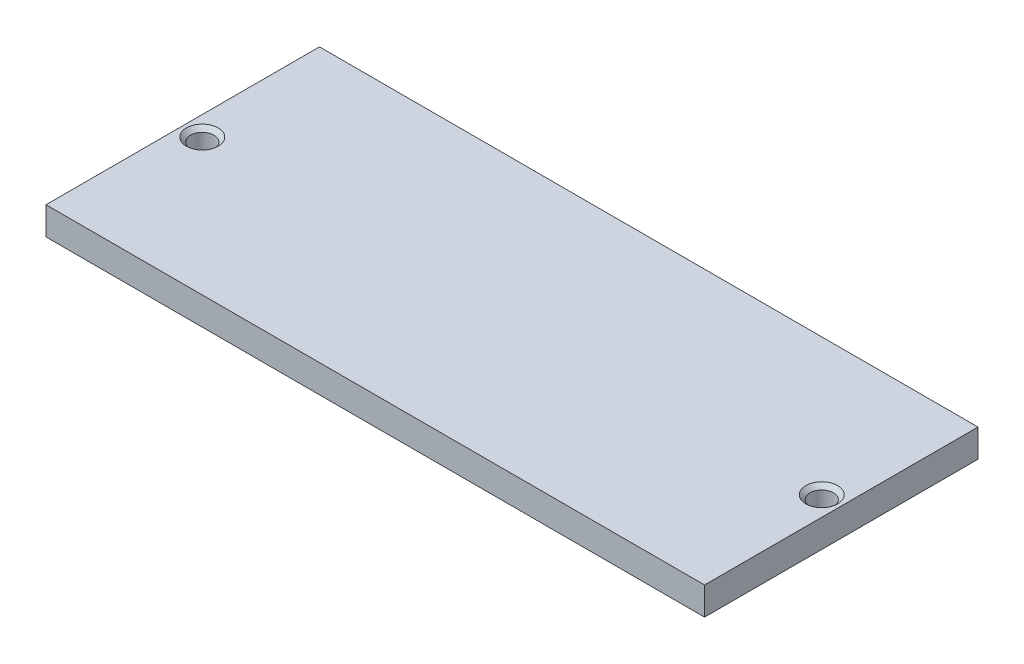
ISO-10303-21;
HEADER;
FILE_DESCRIPTION(('STEP AP214'),'2;1');
FILE_NAME('part.step','',(''),(''),'','','');
FILE_SCHEMA(('AUTOMOTIVE_DESIGN { 1 0 10303 214 1 1 1 1 }'));
ENDSEC;
DATA;
#1=APPLICATION_CONTEXT('core data for automotive mechanical design processes');
#2=APPLICATION_PROTOCOL_DEFINITION('international standard','automotive_design',2000,#1);
#3=PRODUCT_CONTEXT('',#1,'mechanical');
#4=PRODUCT('Part','Part','',(#3));
#5=PRODUCT_RELATED_PRODUCT_CATEGORY('part','',(#4));
#6=PRODUCT_DEFINITION_FORMATION('','',#4);
#7=PRODUCT_DEFINITION_CONTEXT('part definition',#1,'design');
#8=PRODUCT_DEFINITION('design','',#6,#7);
#9=PRODUCT_DEFINITION_SHAPE('','',#8);
#10=(LENGTH_UNIT() NAMED_UNIT(*) SI_UNIT(.MILLI.,.METRE.));
#11=(NAMED_UNIT(*) PLANE_ANGLE_UNIT() SI_UNIT($,.RADIAN.));
#12=(NAMED_UNIT(*) SI_UNIT($,.STERADIAN.) SOLID_ANGLE_UNIT());
#13=UNCERTAINTY_MEASURE_WITH_UNIT(LENGTH_MEASURE(1.E-05),#10,'distance_accuracy_value','');
#14=(GEOMETRIC_REPRESENTATION_CONTEXT(3) GLOBAL_UNCERTAINTY_ASSIGNED_CONTEXT((#13)) GLOBAL_UNIT_ASSIGNED_CONTEXT((#10,
#11,#12)) REPRESENTATION_CONTEXT('',''));
#15=CARTESIAN_POINT('',(0.,0.,0.));
#16=DIRECTION('',(0.,0.,1.));
#17=DIRECTION('',(1.,0.,0.));
#18=AXIS2_PLACEMENT_3D('',#15,#16,#17);
#19=CARTESIAN_POINT('',(59.,31.6666666666667,-29.));
#20=DIRECTION('',(-1.,0.,0.));
#21=DIRECTION('',(0.,0.,1.));
#22=AXIS2_PLACEMENT_3D('',#19,#20,#21);
#23=PLANE('',#22);
#24=DIRECTION('',(0.,0.,-1.));
#25=VECTOR('',#24,1.);
#26=CARTESIAN_POINT('',(59.,26.6666666666667,-29.));
#27=LINE('',#26,#25);
#28=CARTESIAN_POINT('',(59.,26.6666666666667,20.));
#29=VERTEX_POINT('',#28);
#30=CARTESIAN_POINT('',(59.,26.6666666666667,-29.));
#31=VERTEX_POINT('',#30);
#32=EDGE_CURVE('E108',#29,#31,#27,.T.);
#33=ORIENTED_EDGE('',*,*,#32,.T.);
#34=DIRECTION('',(0.,-1.,0.));
#35=VECTOR('',#34,1.);
#36=CARTESIAN_POINT('',(59.,31.6666666666667,-29.));
#37=LINE('',#36,#35);
#38=CARTESIAN_POINT('',(59.,31.6666666666667,-29.));
#39=VERTEX_POINT('',#38);
#40=EDGE_CURVE('E99',#39,#31,#37,.T.);
#41=ORIENTED_EDGE('',*,*,#40,.F.);
#42=DIRECTION('',(0.,0.,-1.));
#43=VECTOR('',#42,1.);
#44=CARTESIAN_POINT('',(59.,31.6666666666667,-29.));
#45=LINE('',#44,#43);
#46=CARTESIAN_POINT('',(59.,31.6666666666667,20.));
#47=VERTEX_POINT('',#46);
#48=EDGE_CURVE('E93',#47,#39,#45,.T.);
#49=ORIENTED_EDGE('',*,*,#48,.F.);
#50=DIRECTION('',(0.,-1.,0.));
#51=VECTOR('',#50,1.);
#52=CARTESIAN_POINT('',(59.,31.6666666666667,20.));
#53=LINE('',#52,#51);
#54=EDGE_CURVE('E104',#47,#29,#53,.T.);
#55=ORIENTED_EDGE('',*,*,#54,.T.);
#56=EDGE_LOOP('',(#33,#41,#49,#55));
#57=FACE_BOUND('',#56,.T.);
#58=ADVANCED_FACE('F39',(#57),#23,.F.);
#59=CARTESIAN_POINT('',(59.,31.6666666666667,-29.));
#60=DIRECTION('',(0.,0.,1.));
#61=DIRECTION('',(0.,-1.,0.));
#62=AXIS2_PLACEMENT_3D('',#59,#60,#61);
#63=PLANE('',#62);
#64=DIRECTION('',(-1.,0.,0.));
#65=VECTOR('',#64,1.);
#66=CARTESIAN_POINT('',(59.,26.6666666666667,-29.));
#67=LINE('',#66,#65);
#68=CARTESIAN_POINT('',(-59.,26.6666666666667,-29.));
#69=VERTEX_POINT('',#68);
#70=EDGE_CURVE('E98',#31,#69,#67,.T.);
#71=ORIENTED_EDGE('',*,*,#70,.T.);
#72=DIRECTION('',(0.,-1.,0.));
#73=VECTOR('',#72,1.);
#74=CARTESIAN_POINT('',(-59.,31.6666666666667,-29.));
#75=LINE('',#74,#73);
#76=CARTESIAN_POINT('',(-59.,31.6666666666667,-29.));
#77=VERTEX_POINT('',#76);
#78=EDGE_CURVE('E96',#77,#69,#75,.T.);
#79=ORIENTED_EDGE('',*,*,#78,.F.);
#80=DIRECTION('',(-1.,0.,0.));
#81=VECTOR('',#80,1.);
#82=CARTESIAN_POINT('',(59.,31.6666666666667,-29.));
#83=LINE('',#82,#81);
#84=EDGE_CURVE('E88',#39,#77,#83,.T.);
#85=ORIENTED_EDGE('',*,*,#84,.F.);
#86=ORIENTED_EDGE('',*,*,#40,.T.);
#87=EDGE_LOOP('',(#71,#79,#85,#86));
#88=FACE_BOUND('',#87,.T.);
#89=ADVANCED_FACE('F97',(#88),#63,.F.);
#90=CARTESIAN_POINT('',(-59.,31.6666666666667,-29.));
#91=DIRECTION('',(1.,0.,0.));
#92=DIRECTION('',(0.,0.,-1.));
#93=AXIS2_PLACEMENT_3D('',#90,#91,#92);
#94=PLANE('',#93);
#95=DIRECTION('',(0.,0.,1.));
#96=VECTOR('',#95,1.);
#97=CARTESIAN_POINT('',(-59.,26.6666666666667,-29.));
#98=LINE('',#97,#96);
#99=CARTESIAN_POINT('',(-59.,26.6666666666667,20.));
#100=VERTEX_POINT('',#99);
#101=EDGE_CURVE('E74',#69,#100,#98,.T.);
#102=ORIENTED_EDGE('',*,*,#101,.T.);
#103=DIRECTION('',(0.,-1.,0.));
#104=VECTOR('',#103,1.);
#105=CARTESIAN_POINT('',(-59.,31.6666666666667,20.));
#106=LINE('',#105,#104);
#107=CARTESIAN_POINT('',(-59.,31.6666666666667,20.));
#108=VERTEX_POINT('',#107);
#109=EDGE_CURVE('E100',#108,#100,#106,.T.);
#110=ORIENTED_EDGE('',*,*,#109,.F.);
#111=DIRECTION('',(0.,0.,1.));
#112=VECTOR('',#111,1.);
#113=CARTESIAN_POINT('',(-59.,31.6666666666667,-29.));
#114=LINE('',#113,#112);
#115=EDGE_CURVE('E91',#77,#108,#114,.T.);
#116=ORIENTED_EDGE('',*,*,#115,.F.);
#117=ORIENTED_EDGE('',*,*,#78,.T.);
#118=EDGE_LOOP('',(#102,#110,#116,#117));
#119=FACE_BOUND('',#118,.T.);
#120=ADVANCED_FACE('F102',(#119),#94,.F.);
#121=CARTESIAN_POINT('',(59.,31.6666666666667,20.));
#122=DIRECTION('',(0.,0.,-1.));
#123=DIRECTION('',(0.,1.,0.));
#124=AXIS2_PLACEMENT_3D('',#121,#122,#123);
#125=PLANE('',#124);
#126=DIRECTION('',(1.,0.,0.));
#127=VECTOR('',#126,1.);
#128=CARTESIAN_POINT('',(59.,26.6666666666667,20.));
#129=LINE('',#128,#127);
#130=EDGE_CURVE('E80',#100,#29,#129,.T.);
#131=ORIENTED_EDGE('',*,*,#130,.T.);
#132=ORIENTED_EDGE('',*,*,#54,.F.);
#133=DIRECTION('',(1.,0.,0.));
#134=VECTOR('',#133,1.);
#135=CARTESIAN_POINT('',(59.,31.6666666666667,20.));
#136=LINE('',#135,#134);
#137=EDGE_CURVE('E57',#108,#47,#136,.T.);
#138=ORIENTED_EDGE('',*,*,#137,.F.);
#139=ORIENTED_EDGE('',*,*,#109,.T.);
#140=EDGE_LOOP('',(#131,#132,#138,#139));
#141=FACE_BOUND('',#140,.T.);
#142=ADVANCED_FACE('F148',(#141),#125,.F.);
#143=CARTESIAN_POINT('',(0.,31.6666666666667,0.));
#144=DIRECTION('',(0.,-1.,0.));
#145=DIRECTION('',(0.,0.,-1.));
#146=AXIS2_PLACEMENT_3D('',#143,#144,#145);
#147=PLANE('',#146);
#148=CARTESIAN_POINT('',(55.5,31.6666666666667,-4.49999999999999));
#149=DIRECTION('',(0.,1.,0.));
#150=DIRECTION('',(0.,0.,-1.));
#151=AXIS2_PLACEMENT_3D('',#148,#149,#150);
#152=CIRCLE('',#151,2.85000000000001);
#153=CARTESIAN_POINT('',(55.5,31.6666666666667,-7.34999999999999));
#154=VERTEX_POINT('',#153);
#155=EDGE_CURVE('E164',#154,#154,#152,.T.);
#156=ORIENTED_EDGE('',*,*,#155,.F.);
#157=EDGE_LOOP('',(#156));
#158=FACE_BOUND('',#157,.T.);
#159=CARTESIAN_POINT('',(-55.5,31.6666666666667,-4.49999999999999));
#160=DIRECTION('',(0.,-1.,0.));
#161=DIRECTION('',(0.,0.,-1.));
#162=AXIS2_PLACEMENT_3D('',#159,#160,#161);
#163=CIRCLE('',#162,2.85000000000001);
#164=CARTESIAN_POINT('',(-55.5,31.6666666666667,-7.34999999999999));
#165=VERTEX_POINT('',#164);
#166=EDGE_CURVE('E11',#165,#165,#163,.T.);
#167=ORIENTED_EDGE('',*,*,#166,.T.);
#168=EDGE_LOOP('',(#167));
#169=FACE_BOUND('',#168,.T.);
#170=ORIENTED_EDGE('',*,*,#48,.T.);
#171=ORIENTED_EDGE('',*,*,#84,.T.);
#172=ORIENTED_EDGE('',*,*,#115,.T.);
#173=ORIENTED_EDGE('',*,*,#137,.T.);
#174=EDGE_LOOP('',(#170,#171,#172,#173));
#175=FACE_BOUND('',#174,.T.);
#176=ADVANCED_FACE('F89',(#158,#169,#175),#147,.F.);
#177=CARTESIAN_POINT('',(0.,26.6666666666667,0.));
#178=DIRECTION('',(0.,-1.,0.));
#179=DIRECTION('',(0.,0.,-1.));
#180=AXIS2_PLACEMENT_3D('',#177,#178,#179);
#181=PLANE('',#180);
#182=CARTESIAN_POINT('',(55.5,26.6666666666667,-4.49999999999999));
#183=DIRECTION('',(0.,1.,0.));
#184=DIRECTION('',(0.,0.,-1.));
#185=AXIS2_PLACEMENT_3D('',#182,#183,#184);
#186=CIRCLE('',#185,2.1);
#187=CARTESIAN_POINT('',(55.5,26.6666666666667,-6.59999999999998));
#188=VERTEX_POINT('',#187);
#189=EDGE_CURVE('E167',#188,#188,#186,.T.);
#190=ORIENTED_EDGE('',*,*,#189,.T.);
#191=EDGE_LOOP('',(#190));
#192=FACE_BOUND('',#191,.T.);
#193=CARTESIAN_POINT('',(-55.5,26.6666666666667,-4.49999999999999));
#194=DIRECTION('',(0.,-1.,0.));
#195=DIRECTION('',(0.,0.,-1.));
#196=AXIS2_PLACEMENT_3D('',#193,#194,#195);
#197=CIRCLE('',#196,2.1);
#198=CARTESIAN_POINT('',(-55.5,26.6666666666667,-6.59999999999998));
#199=VERTEX_POINT('',#198);
#200=EDGE_CURVE('E111',#199,#199,#197,.T.);
#201=ORIENTED_EDGE('',*,*,#200,.F.);
#202=EDGE_LOOP('',(#201));
#203=FACE_BOUND('',#202,.T.);
#204=ORIENTED_EDGE('',*,*,#32,.F.);
#205=ORIENTED_EDGE('',*,*,#130,.F.);
#206=ORIENTED_EDGE('',*,*,#101,.F.);
#207=ORIENTED_EDGE('',*,*,#70,.F.);
#208=EDGE_LOOP('',(#204,#205,#206,#207));
#209=FACE_BOUND('',#208,.T.);
#210=ADVANCED_FACE('F136',(#192,#203,#209),#181,.T.);
#211=CARTESIAN_POINT('',(-55.5,10.9968181856832,-4.49999999999999));
#212=DIRECTION('',(0.,1.,0.));
#213=DIRECTION('',(0.,0.,1.));
#214=AXIS2_PLACEMENT_3D('',#211,#212,#213);
#215=CYLINDRICAL_SURFACE('',#214,2.1);
#216=CARTESIAN_POINT('',(-55.5,30.9166666666667,-4.49999999999999));
#217=DIRECTION('',(0.,-1.,0.));
#218=DIRECTION('',(0.,0.,-1.));
#219=AXIS2_PLACEMENT_3D('',#216,#217,#218);
#220=CIRCLE('',#219,2.1);
#221=CARTESIAN_POINT('',(-55.5,30.9166666666667,-6.59999999999998));
#222=VERTEX_POINT('',#221);
#223=EDGE_CURVE('E49',#222,#222,#220,.F.);
#224=ORIENTED_EDGE('',*,*,#223,.T.);
#225=EDGE_LOOP('',(#224));
#226=FACE_BOUND('',#225,.T.);
#227=ORIENTED_EDGE('',*,*,#200,.T.);
#228=EDGE_LOOP('',(#227));
#229=FACE_BOUND('',#228,.T.);
#230=ADVANCED_FACE('F123',(#226,#229),#215,.F.);
#231=CARTESIAN_POINT('',(-55.5,30.9166666666667,-4.49999999999999));
#232=DIRECTION('',(0.,1.,0.));
#233=DIRECTION('',(0.,0.,1.));
#234=AXIS2_PLACEMENT_3D('',#231,#232,#233);
#235=CONICAL_SURFACE('',#234,2.1,0.785398163397444);
#236=ORIENTED_EDGE('',*,*,#166,.F.);
#237=EDGE_LOOP('',(#236));
#238=FACE_BOUND('',#237,.T.);
#239=ORIENTED_EDGE('',*,*,#223,.F.);
#240=EDGE_LOOP('',(#239));
#241=FACE_BOUND('',#240,.T.);
#242=ADVANCED_FACE('F42',(#238,#241),#235,.F.);
#243=CARTESIAN_POINT('',(55.5,10.9968181856832,-4.49999999999999));
#244=DIRECTION('',(0.,1.,0.));
#245=DIRECTION('',(0.,0.,1.));
#246=AXIS2_PLACEMENT_3D('',#243,#244,#245);
#247=CYLINDRICAL_SURFACE('',#246,2.1);
#248=CARTESIAN_POINT('',(55.5,30.9166666666667,-4.49999999999999));
#249=DIRECTION('',(0.,1.,0.));
#250=DIRECTION('',(0.,0.,-1.));
#251=AXIS2_PLACEMENT_3D('',#248,#249,#250);
#252=CIRCLE('',#251,2.1);
#253=CARTESIAN_POINT('',(55.5,30.9166666666667,-6.59999999999998));
#254=VERTEX_POINT('',#253);
#255=EDGE_CURVE('E119',#254,#254,#252,.F.);
#256=ORIENTED_EDGE('',*,*,#255,.F.);
#257=EDGE_LOOP('',(#256));
#258=FACE_BOUND('',#257,.T.);
#259=ORIENTED_EDGE('',*,*,#189,.F.);
#260=EDGE_LOOP('',(#259));
#261=FACE_BOUND('',#260,.T.);
#262=ADVANCED_FACE('F127',(#258,#261),#247,.F.);
#263=CARTESIAN_POINT('',(55.5,30.9166666666667,-4.49999999999999));
#264=DIRECTION('',(0.,1.,0.));
#265=DIRECTION('',(0.,0.,1.));
#266=AXIS2_PLACEMENT_3D('',#263,#264,#265);
#267=CONICAL_SURFACE('',#266,2.1,0.785398163397444);
#268=ORIENTED_EDGE('',*,*,#155,.T.);
#269=EDGE_LOOP('',(#268));
#270=FACE_BOUND('',#269,.T.);
#271=ORIENTED_EDGE('',*,*,#255,.T.);
#272=EDGE_LOOP('',(#271));
#273=FACE_BOUND('',#272,.T.);
#274=ADVANCED_FACE('F133',(#270,#273),#267,.F.);
#275=CLOSED_SHELL('',(#58,#89,#120,#142,#176,#210,#230,#242,#262,#274));
#276=MANIFOLD_SOLID_BREP('B2',#275);
#277=ADVANCED_BREP_SHAPE_REPRESENTATION('',(#18,#276),#14);
#278=SHAPE_DEFINITION_REPRESENTATION(#9,#277);
ENDSEC;
END-ISO-10303-21;
